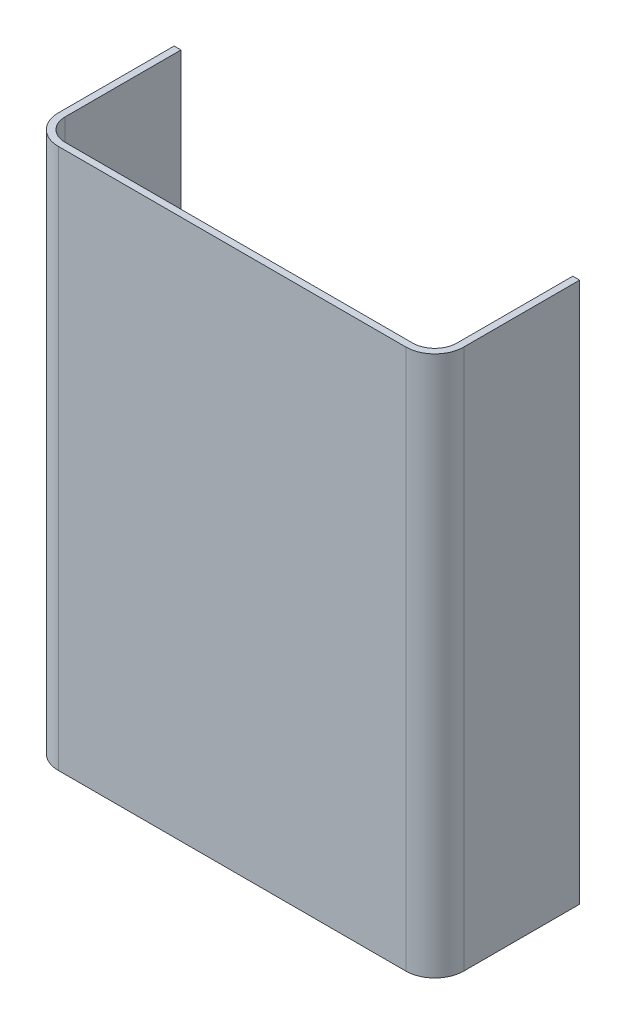
ISO-10303-21;
HEADER;
FILE_DESCRIPTION(('STEP AP214'),'2;1');
FILE_NAME('part.step','',(''),(''),'','','');
FILE_SCHEMA(('AUTOMOTIVE_DESIGN { 1 0 10303 214 1 1 1 1 }'));
ENDSEC;
DATA;
#1=APPLICATION_CONTEXT('core data for automotive mechanical design processes');
#2=APPLICATION_PROTOCOL_DEFINITION('international standard','automotive_design',2000,#1);
#3=PRODUCT_CONTEXT('',#1,'mechanical');
#4=PRODUCT('Part','Part','',(#3));
#5=PRODUCT_RELATED_PRODUCT_CATEGORY('part','',(#4));
#6=PRODUCT_DEFINITION_FORMATION('','',#4);
#7=PRODUCT_DEFINITION_CONTEXT('part definition',#1,'design');
#8=PRODUCT_DEFINITION('design','',#6,#7);
#9=PRODUCT_DEFINITION_SHAPE('','',#8);
#10=(LENGTH_UNIT() NAMED_UNIT(*) SI_UNIT(.MILLI.,.METRE.));
#11=(NAMED_UNIT(*) PLANE_ANGLE_UNIT() SI_UNIT($,.RADIAN.));
#12=(NAMED_UNIT(*) SI_UNIT($,.STERADIAN.) SOLID_ANGLE_UNIT());
#13=UNCERTAINTY_MEASURE_WITH_UNIT(LENGTH_MEASURE(1.E-05),#10,'distance_accuracy_value','');
#14=(GEOMETRIC_REPRESENTATION_CONTEXT(3) GLOBAL_UNCERTAINTY_ASSIGNED_CONTEXT((#13)) GLOBAL_UNIT_ASSIGNED_CONTEXT((#10,
#11,#12)) REPRESENTATION_CONTEXT('',''));
#15=CARTESIAN_POINT('',(0.,0.,0.));
#16=DIRECTION('',(0.,0.,1.));
#17=DIRECTION('',(1.,0.,0.));
#18=AXIS2_PLACEMENT_3D('',#15,#16,#17);
#19=CARTESIAN_POINT('',(76.2,237.,50.8));
#20=DIRECTION('',(0.,-1.,0.));
#21=DIRECTION('',(0.,0.,-1.));
#22=AXIS2_PLACEMENT_3D('',#19,#20,#21);
#23=CYLINDRICAL_SURFACE('',#22,12.7);
#24=CARTESIAN_POINT('',(76.2,0.,50.8));
#25=DIRECTION('',(0.,1.,0.));
#26=DIRECTION('',(0.,0.,1.));
#27=AXIS2_PLACEMENT_3D('',#24,#25,#26);
#28=CIRCLE('',#27,12.7);
#29=CARTESIAN_POINT('',(76.1999999999999,0.,63.5));
#30=VERTEX_POINT('',#29);
#31=CARTESIAN_POINT('',(88.9,0.,50.7999999999999));
#32=VERTEX_POINT('',#31);
#33=EDGE_CURVE('E177',#30,#32,#28,.T.);
#34=ORIENTED_EDGE('',*,*,#33,.T.);
#35=DIRECTION('',(0.,-1.,0.));
#36=VECTOR('',#35,1.);
#37=CARTESIAN_POINT('',(88.9,237.,50.7999999999999));
#38=LINE('',#37,#36);
#39=CARTESIAN_POINT('',(88.9,237.,50.7999999999999));
#40=VERTEX_POINT('',#39);
#41=EDGE_CURVE('E11',#40,#32,#38,.T.);
#42=ORIENTED_EDGE('',*,*,#41,.F.);
#43=CARTESIAN_POINT('',(76.2,237.,50.8));
#44=DIRECTION('',(0.,1.,0.));
#45=DIRECTION('',(0.,0.,1.));
#46=AXIS2_PLACEMENT_3D('',#43,#44,#45);
#47=CIRCLE('',#46,12.7);
#48=CARTESIAN_POINT('',(76.1999999999999,237.,63.5));
#49=VERTEX_POINT('',#48);
#50=EDGE_CURVE('E209',#49,#40,#47,.T.);
#51=ORIENTED_EDGE('',*,*,#50,.F.);
#52=DIRECTION('',(0.,-1.,0.));
#53=VECTOR('',#52,1.);
#54=CARTESIAN_POINT('',(76.1999999999999,237.,63.5));
#55=LINE('',#54,#53);
#56=EDGE_CURVE('E173',#49,#30,#55,.T.);
#57=ORIENTED_EDGE('',*,*,#56,.T.);
#58=EDGE_LOOP('',(#34,#42,#51,#57));
#59=FACE_BOUND('',#58,.T.);
#60=ADVANCED_FACE('F49',(#59),#23,.T.);
#61=CARTESIAN_POINT('',(88.9,237.,0.));
#62=DIRECTION('',(-1.,0.,0.));
#63=DIRECTION('',(0.,0.,1.));
#64=AXIS2_PLACEMENT_3D('',#61,#62,#63);
#65=PLANE('',#64);
#66=DIRECTION('',(0.,0.,-1.));
#67=VECTOR('',#66,1.);
#68=CARTESIAN_POINT('',(88.9,0.,0.));
#69=LINE('',#68,#67);
#70=CARTESIAN_POINT('',(88.9,0.,0.));
#71=VERTEX_POINT('',#70);
#72=EDGE_CURVE('E181',#32,#71,#69,.T.);
#73=ORIENTED_EDGE('',*,*,#72,.T.);
#74=DIRECTION('',(0.,-1.,0.));
#75=VECTOR('',#74,1.);
#76=CARTESIAN_POINT('',(88.9,237.,0.));
#77=LINE('',#76,#75);
#78=CARTESIAN_POINT('',(88.9,237.,0.));
#79=VERTEX_POINT('',#78);
#80=EDGE_CURVE('E58',#79,#71,#77,.T.);
#81=ORIENTED_EDGE('',*,*,#80,.F.);
#82=DIRECTION('',(0.,0.,-1.));
#83=VECTOR('',#82,1.);
#84=CARTESIAN_POINT('',(88.9,237.,0.));
#85=LINE('',#84,#83);
#86=EDGE_CURVE('E121',#40,#79,#85,.T.);
#87=ORIENTED_EDGE('',*,*,#86,.F.);
#88=ORIENTED_EDGE('',*,*,#41,.T.);
#89=EDGE_LOOP('',(#73,#81,#87,#88));
#90=FACE_BOUND('',#89,.T.);
#91=ADVANCED_FACE('F322',(#90),#65,.F.);
#92=CARTESIAN_POINT('',(85.9,237.,0.));
#93=DIRECTION('',(0.,0.,1.));
#94=DIRECTION('',(1.,0.,0.));
#95=AXIS2_PLACEMENT_3D('',#92,#93,#94);
#96=PLANE('',#95);
#97=DIRECTION('',(-1.,0.,0.));
#98=VECTOR('',#97,1.);
#99=CARTESIAN_POINT('',(85.9,0.,0.));
#100=LINE('',#99,#98);
#101=CARTESIAN_POINT('',(85.9,0.,0.));
#102=VERTEX_POINT('',#101);
#103=EDGE_CURVE('E184',#71,#102,#100,.T.);
#104=ORIENTED_EDGE('',*,*,#103,.T.);
#105=DIRECTION('',(0.,-1.,0.));
#106=VECTOR('',#105,1.);
#107=CARTESIAN_POINT('',(85.9,237.,0.));
#108=LINE('',#107,#106);
#109=CARTESIAN_POINT('',(85.9,237.,0.));
#110=VERTEX_POINT('',#109);
#111=EDGE_CURVE('E236',#110,#102,#108,.T.);
#112=ORIENTED_EDGE('',*,*,#111,.F.);
#113=DIRECTION('',(-1.,0.,0.));
#114=VECTOR('',#113,1.);
#115=CARTESIAN_POINT('',(85.9,237.,0.));
#116=LINE('',#115,#114);
#117=EDGE_CURVE('E247',#79,#110,#116,.T.);
#118=ORIENTED_EDGE('',*,*,#117,.F.);
#119=ORIENTED_EDGE('',*,*,#80,.T.);
#120=EDGE_LOOP('',(#104,#112,#118,#119));
#121=FACE_BOUND('',#120,.T.);
#122=ADVANCED_FACE('F245',(#121),#96,.F.);
#123=CARTESIAN_POINT('',(85.9,237.,0.));
#124=DIRECTION('',(1.,0.,0.));
#125=DIRECTION('',(0.,0.,-1.));
#126=AXIS2_PLACEMENT_3D('',#123,#124,#125);
#127=PLANE('',#126);
#128=DIRECTION('',(0.,0.,1.));
#129=VECTOR('',#128,1.);
#130=CARTESIAN_POINT('',(85.9,0.,0.));
#131=LINE('',#130,#129);
#132=CARTESIAN_POINT('',(85.9,0.,50.7999999999999));
#133=VERTEX_POINT('',#132);
#134=EDGE_CURVE('E187',#102,#133,#131,.T.);
#135=ORIENTED_EDGE('',*,*,#134,.T.);
#136=DIRECTION('',(0.,-1.,0.));
#137=VECTOR('',#136,1.);
#138=CARTESIAN_POINT('',(85.9,237.,50.7999999999999));
#139=LINE('',#138,#137);
#140=CARTESIAN_POINT('',(85.9,237.,50.7999999999999));
#141=VERTEX_POINT('',#140);
#142=EDGE_CURVE('E232',#141,#133,#139,.T.);
#143=ORIENTED_EDGE('',*,*,#142,.F.);
#144=DIRECTION('',(0.,0.,1.));
#145=VECTOR('',#144,1.);
#146=CARTESIAN_POINT('',(85.9,237.,0.));
#147=LINE('',#146,#145);
#148=EDGE_CURVE('E266',#110,#141,#147,.T.);
#149=ORIENTED_EDGE('',*,*,#148,.F.);
#150=ORIENTED_EDGE('',*,*,#111,.T.);
#151=EDGE_LOOP('',(#135,#143,#149,#150));
#152=FACE_BOUND('',#151,.T.);
#153=ADVANCED_FACE('F256',(#152),#127,.F.);
#154=CARTESIAN_POINT('',(76.2,237.,50.8));
#155=DIRECTION('',(0.,-1.,0.));
#156=DIRECTION('',(0.,0.,-1.));
#157=AXIS2_PLACEMENT_3D('',#154,#155,#156);
#158=CYLINDRICAL_SURFACE('',#157,9.69999999999999);
#159=CARTESIAN_POINT('',(76.2,0.,50.8));
#160=DIRECTION('',(0.,-1.,0.));
#161=DIRECTION('',(0.,0.,1.));
#162=AXIS2_PLACEMENT_3D('',#159,#160,#161);
#163=CIRCLE('',#162,9.69999999999999);
#164=CARTESIAN_POINT('',(76.1999999999999,0.,60.5));
#165=VERTEX_POINT('',#164);
#166=EDGE_CURVE('E190',#133,#165,#163,.T.);
#167=ORIENTED_EDGE('',*,*,#166,.T.);
#168=DIRECTION('',(0.,-1.,0.));
#169=VECTOR('',#168,1.);
#170=CARTESIAN_POINT('',(76.1999999999999,237.,60.5));
#171=LINE('',#170,#169);
#172=CARTESIAN_POINT('',(76.1999999999999,237.,60.5));
#173=VERTEX_POINT('',#172);
#174=EDGE_CURVE('E228',#173,#165,#171,.T.);
#175=ORIENTED_EDGE('',*,*,#174,.F.);
#176=CARTESIAN_POINT('',(76.2,237.,50.8));
#177=DIRECTION('',(0.,-1.,0.));
#178=DIRECTION('',(0.,0.,1.));
#179=AXIS2_PLACEMENT_3D('',#176,#177,#178);
#180=CIRCLE('',#179,9.69999999999999);
#181=EDGE_CURVE('E262',#141,#173,#180,.T.);
#182=ORIENTED_EDGE('',*,*,#181,.F.);
#183=ORIENTED_EDGE('',*,*,#142,.T.);
#184=EDGE_LOOP('',(#167,#175,#182,#183));
#185=FACE_BOUND('',#184,.T.);
#186=ADVANCED_FACE('F260',(#185),#158,.F.);
#187=CARTESIAN_POINT('',(-76.1999999999999,237.,60.5));
#188=DIRECTION('',(0.,0.,1.));
#189=DIRECTION('',(1.,0.,0.));
#190=AXIS2_PLACEMENT_3D('',#187,#188,#189);
#191=PLANE('',#190);
#192=DIRECTION('',(-1.,0.,0.));
#193=VECTOR('',#192,1.);
#194=CARTESIAN_POINT('',(-76.1999999999999,0.,60.5));
#195=LINE('',#194,#193);
#196=CARTESIAN_POINT('',(-76.2,0.,60.5));
#197=VERTEX_POINT('',#196);
#198=EDGE_CURVE('E193',#165,#197,#195,.T.);
#199=ORIENTED_EDGE('',*,*,#198,.T.);
#200=DIRECTION('',(0.,-1.,0.));
#201=VECTOR('',#200,1.);
#202=CARTESIAN_POINT('',(-76.2,237.,60.5));
#203=LINE('',#202,#201);
#204=CARTESIAN_POINT('',(-76.2,237.,60.5));
#205=VERTEX_POINT('',#204);
#206=EDGE_CURVE('E224',#205,#197,#203,.T.);
#207=ORIENTED_EDGE('',*,*,#206,.F.);
#208=DIRECTION('',(-1.,0.,0.));
#209=VECTOR('',#208,1.);
#210=CARTESIAN_POINT('',(-76.1999999999999,237.,60.5));
#211=LINE('',#210,#209);
#212=EDGE_CURVE('E265',#173,#205,#211,.T.);
#213=ORIENTED_EDGE('',*,*,#212,.F.);
#214=ORIENTED_EDGE('',*,*,#174,.T.);
#215=EDGE_LOOP('',(#199,#207,#213,#214));
#216=FACE_BOUND('',#215,.T.);
#217=ADVANCED_FACE('F333',(#216),#191,.F.);
#218=CARTESIAN_POINT('',(-76.2,237.,50.8));
#219=DIRECTION('',(0.,-1.,0.));
#220=DIRECTION('',(0.,0.,-1.));
#221=AXIS2_PLACEMENT_3D('',#218,#219,#220);
#222=CYLINDRICAL_SURFACE('',#221,9.69999999999999);
#223=CARTESIAN_POINT('',(-76.2,0.,50.8));
#224=DIRECTION('',(0.,-1.,0.));
#225=DIRECTION('',(0.,0.,1.));
#226=AXIS2_PLACEMENT_3D('',#223,#224,#225);
#227=CIRCLE('',#226,9.69999999999999);
#228=CARTESIAN_POINT('',(-85.9,0.,50.7999999999999));
#229=VERTEX_POINT('',#228);
#230=EDGE_CURVE('E196',#197,#229,#227,.T.);
#231=ORIENTED_EDGE('',*,*,#230,.T.);
#232=DIRECTION('',(0.,-1.,0.));
#233=VECTOR('',#232,1.);
#234=CARTESIAN_POINT('',(-85.9,237.,50.7999999999999));
#235=LINE('',#234,#233);
#236=CARTESIAN_POINT('',(-85.9,237.,50.7999999999999));
#237=VERTEX_POINT('',#236);
#238=EDGE_CURVE('E220',#237,#229,#235,.T.);
#239=ORIENTED_EDGE('',*,*,#238,.F.);
#240=CARTESIAN_POINT('',(-76.2,237.,50.8));
#241=DIRECTION('',(0.,-1.,0.));
#242=DIRECTION('',(0.,0.,1.));
#243=AXIS2_PLACEMENT_3D('',#240,#241,#242);
#244=CIRCLE('',#243,9.69999999999999);
#245=EDGE_CURVE('E271',#205,#237,#244,.T.);
#246=ORIENTED_EDGE('',*,*,#245,.F.);
#247=ORIENTED_EDGE('',*,*,#206,.T.);
#248=EDGE_LOOP('',(#231,#239,#246,#247));
#249=FACE_BOUND('',#248,.T.);
#250=ADVANCED_FACE('F336',(#249),#222,.F.);
#251=CARTESIAN_POINT('',(-85.9,237.,0.));
#252=DIRECTION('',(-1.,0.,0.));
#253=DIRECTION('',(0.,0.,1.));
#254=AXIS2_PLACEMENT_3D('',#251,#252,#253);
#255=PLANE('',#254);
#256=DIRECTION('',(0.,0.,-1.));
#257=VECTOR('',#256,1.);
#258=CARTESIAN_POINT('',(-85.9,0.,0.));
#259=LINE('',#258,#257);
#260=CARTESIAN_POINT('',(-85.9,0.,0.));
#261=VERTEX_POINT('',#260);
#262=EDGE_CURVE('E199',#229,#261,#259,.T.);
#263=ORIENTED_EDGE('',*,*,#262,.T.);
#264=DIRECTION('',(0.,-1.,0.));
#265=VECTOR('',#264,1.);
#266=CARTESIAN_POINT('',(-85.9,237.,0.));
#267=LINE('',#266,#265);
#268=CARTESIAN_POINT('',(-85.9,237.,0.));
#269=VERTEX_POINT('',#268);
#270=EDGE_CURVE('E216',#269,#261,#267,.T.);
#271=ORIENTED_EDGE('',*,*,#270,.F.);
#272=DIRECTION('',(0.,0.,-1.));
#273=VECTOR('',#272,1.);
#274=CARTESIAN_POINT('',(-85.9,237.,0.));
#275=LINE('',#274,#273);
#276=EDGE_CURVE('E279',#237,#269,#275,.T.);
#277=ORIENTED_EDGE('',*,*,#276,.F.);
#278=ORIENTED_EDGE('',*,*,#238,.T.);
#279=EDGE_LOOP('',(#263,#271,#277,#278));
#280=FACE_BOUND('',#279,.T.);
#281=ADVANCED_FACE('F340',(#280),#255,.F.);
#282=CARTESIAN_POINT('',(-88.9,237.,0.));
#283=DIRECTION('',(0.,0.,1.));
#284=DIRECTION('',(1.,0.,0.));
#285=AXIS2_PLACEMENT_3D('',#282,#283,#284);
#286=PLANE('',#285);
#287=DIRECTION('',(-1.,0.,0.));
#288=VECTOR('',#287,1.);
#289=CARTESIAN_POINT('',(-88.9,0.,0.));
#290=LINE('',#289,#288);
#291=CARTESIAN_POINT('',(-88.9,0.,0.));
#292=VERTEX_POINT('',#291);
#293=EDGE_CURVE('E201',#261,#292,#290,.T.);
#294=ORIENTED_EDGE('',*,*,#293,.T.);
#295=DIRECTION('',(0.,-1.,0.));
#296=VECTOR('',#295,1.);
#297=CARTESIAN_POINT('',(-88.9,237.,0.));
#298=LINE('',#297,#296);
#299=CARTESIAN_POINT('',(-88.9,237.,0.));
#300=VERTEX_POINT('',#299);
#301=EDGE_CURVE('E163',#300,#292,#298,.T.);
#302=ORIENTED_EDGE('',*,*,#301,.F.);
#303=DIRECTION('',(-1.,0.,0.));
#304=VECTOR('',#303,1.);
#305=CARTESIAN_POINT('',(-88.9,237.,0.));
#306=LINE('',#305,#304);
#307=EDGE_CURVE('E152',#269,#300,#306,.T.);
#308=ORIENTED_EDGE('',*,*,#307,.F.);
#309=ORIENTED_EDGE('',*,*,#270,.T.);
#310=EDGE_LOOP('',(#294,#302,#308,#309));
#311=FACE_BOUND('',#310,.T.);
#312=ADVANCED_FACE('F344',(#311),#286,.F.);
#313=CARTESIAN_POINT('',(-88.9,237.,0.));
#314=DIRECTION('',(1.,0.,0.));
#315=DIRECTION('',(0.,0.,-1.));
#316=AXIS2_PLACEMENT_3D('',#313,#314,#315);
#317=PLANE('',#316);
#318=DIRECTION('',(0.,0.,1.));
#319=VECTOR('',#318,1.);
#320=CARTESIAN_POINT('',(-88.9,0.,0.));
#321=LINE('',#320,#319);
#322=CARTESIAN_POINT('',(-88.9,0.,50.7999999999999));
#323=VERTEX_POINT('',#322);
#324=EDGE_CURVE('E161',#292,#323,#321,.T.);
#325=ORIENTED_EDGE('',*,*,#324,.T.);
#326=DIRECTION('',(0.,-1.,0.));
#327=VECTOR('',#326,1.);
#328=CARTESIAN_POINT('',(-88.9,237.,50.7999999999999));
#329=LINE('',#328,#327);
#330=CARTESIAN_POINT('',(-88.9,237.,50.7999999999999));
#331=VERTEX_POINT('',#330);
#332=EDGE_CURVE('E158',#331,#323,#329,.T.);
#333=ORIENTED_EDGE('',*,*,#332,.F.);
#334=DIRECTION('',(0.,0.,1.));
#335=VECTOR('',#334,1.);
#336=CARTESIAN_POINT('',(-88.9,237.,0.));
#337=LINE('',#336,#335);
#338=EDGE_CURVE('E146',#300,#331,#337,.T.);
#339=ORIENTED_EDGE('',*,*,#338,.F.);
#340=ORIENTED_EDGE('',*,*,#301,.T.);
#341=EDGE_LOOP('',(#325,#333,#339,#340));
#342=FACE_BOUND('',#341,.T.);
#343=ADVANCED_FACE('F159',(#342),#317,.F.);
#344=CARTESIAN_POINT('',(-76.2,237.,50.8));
#345=DIRECTION('',(0.,-1.,0.));
#346=DIRECTION('',(0.,0.,-1.));
#347=AXIS2_PLACEMENT_3D('',#344,#345,#346);
#348=CYLINDRICAL_SURFACE('',#347,12.7);
#349=CARTESIAN_POINT('',(-76.2,0.,50.8));
#350=DIRECTION('',(0.,1.,0.));
#351=DIRECTION('',(0.,0.,1.));
#352=AXIS2_PLACEMENT_3D('',#349,#350,#351);
#353=CIRCLE('',#352,12.7);
#354=CARTESIAN_POINT('',(-76.1999999999999,0.,63.5));
#355=VERTEX_POINT('',#354);
#356=EDGE_CURVE('E107',#323,#355,#353,.T.);
#357=ORIENTED_EDGE('',*,*,#356,.T.);
#358=DIRECTION('',(0.,-1.,0.));
#359=VECTOR('',#358,1.);
#360=CARTESIAN_POINT('',(-76.1999999999999,237.,63.5));
#361=LINE('',#360,#359);
#362=CARTESIAN_POINT('',(-76.1999999999999,237.,63.5));
#363=VERTEX_POINT('',#362);
#364=EDGE_CURVE('E164',#363,#355,#361,.T.);
#365=ORIENTED_EDGE('',*,*,#364,.F.);
#366=CARTESIAN_POINT('',(-76.2,237.,50.8));
#367=DIRECTION('',(0.,1.,0.));
#368=DIRECTION('',(0.,0.,1.));
#369=AXIS2_PLACEMENT_3D('',#366,#367,#368);
#370=CIRCLE('',#369,12.7);
#371=EDGE_CURVE('E150',#331,#363,#370,.T.);
#372=ORIENTED_EDGE('',*,*,#371,.F.);
#373=ORIENTED_EDGE('',*,*,#332,.T.);
#374=EDGE_LOOP('',(#357,#365,#372,#373));
#375=FACE_BOUND('',#374,.T.);
#376=ADVANCED_FACE('F166',(#375),#348,.T.);
#377=CARTESIAN_POINT('',(-76.1999999999999,237.,63.5));
#378=DIRECTION('',(0.,0.,-1.));
#379=DIRECTION('',(-1.,0.,0.));
#380=AXIS2_PLACEMENT_3D('',#377,#378,#379);
#381=PLANE('',#380);
#382=DIRECTION('',(1.,0.,0.));
#383=VECTOR('',#382,1.);
#384=CARTESIAN_POINT('',(-76.1999999999999,0.,63.5));
#385=LINE('',#384,#383);
#386=EDGE_CURVE('E113',#355,#30,#385,.T.);
#387=ORIENTED_EDGE('',*,*,#386,.T.);
#388=ORIENTED_EDGE('',*,*,#56,.F.);
#389=DIRECTION('',(1.,0.,0.));
#390=VECTOR('',#389,1.);
#391=CARTESIAN_POINT('',(-76.1999999999999,237.,63.5));
#392=LINE('',#391,#390);
#393=EDGE_CURVE('E66',#363,#49,#392,.T.);
#394=ORIENTED_EDGE('',*,*,#393,.F.);
#395=ORIENTED_EDGE('',*,*,#364,.T.);
#396=EDGE_LOOP('',(#387,#388,#394,#395));
#397=FACE_BOUND('',#396,.T.);
#398=ADVANCED_FACE('F353',(#397),#381,.F.);
#399=CARTESIAN_POINT('',(76.2,237.,50.8));
#400=DIRECTION('',(0.,1.,0.));
#401=DIRECTION('',(0.,0.,1.));
#402=AXIS2_PLACEMENT_3D('',#399,#400,#401);
#403=PLANE('',#402);
#404=ORIENTED_EDGE('',*,*,#50,.T.);
#405=ORIENTED_EDGE('',*,*,#86,.T.);
#406=ORIENTED_EDGE('',*,*,#117,.T.);
#407=ORIENTED_EDGE('',*,*,#148,.T.);
#408=ORIENTED_EDGE('',*,*,#181,.T.);
#409=ORIENTED_EDGE('',*,*,#212,.T.);
#410=ORIENTED_EDGE('',*,*,#245,.T.);
#411=ORIENTED_EDGE('',*,*,#276,.T.);
#412=ORIENTED_EDGE('',*,*,#307,.T.);
#413=ORIENTED_EDGE('',*,*,#338,.T.);
#414=ORIENTED_EDGE('',*,*,#371,.T.);
#415=ORIENTED_EDGE('',*,*,#393,.T.);
#416=EDGE_LOOP('',(#404,#405,#406,#407,#408,#409,#410,#411,#412,#413,#414,#415));
#417=FACE_BOUND('',#416,.T.);
#418=ADVANCED_FACE('F148',(#417),#403,.T.);
#419=CARTESIAN_POINT('',(76.2,0.,50.8));
#420=DIRECTION('',(0.,1.,0.));
#421=DIRECTION('',(0.,0.,1.));
#422=AXIS2_PLACEMENT_3D('',#419,#420,#421);
#423=PLANE('',#422);
#424=ORIENTED_EDGE('',*,*,#33,.F.);
#425=ORIENTED_EDGE('',*,*,#386,.F.);
#426=ORIENTED_EDGE('',*,*,#356,.F.);
#427=ORIENTED_EDGE('',*,*,#324,.F.);
#428=ORIENTED_EDGE('',*,*,#293,.F.);
#429=ORIENTED_EDGE('',*,*,#262,.F.);
#430=ORIENTED_EDGE('',*,*,#230,.F.);
#431=ORIENTED_EDGE('',*,*,#198,.F.);
#432=ORIENTED_EDGE('',*,*,#166,.F.);
#433=ORIENTED_EDGE('',*,*,#134,.F.);
#434=ORIENTED_EDGE('',*,*,#103,.F.);
#435=ORIENTED_EDGE('',*,*,#72,.F.);
#436=EDGE_LOOP('',(#424,#425,#426,#427,#428,#429,#430,#431,#432,#433,#434,#435));
#437=FACE_BOUND('',#436,.T.);
#438=ADVANCED_FACE('F251',(#437),#423,.F.);
#439=CLOSED_SHELL('',(#60,#91,#122,#153,#186,#217,#250,#281,#312,#343,#376,#398,#418,#438));
#440=MANIFOLD_SOLID_BREP('B2',#439);
#441=ADVANCED_BREP_SHAPE_REPRESENTATION('',(#18,#440),#14);
#442=SHAPE_DEFINITION_REPRESENTATION(#9,#441);
ENDSEC;
END-ISO-10303-21;
